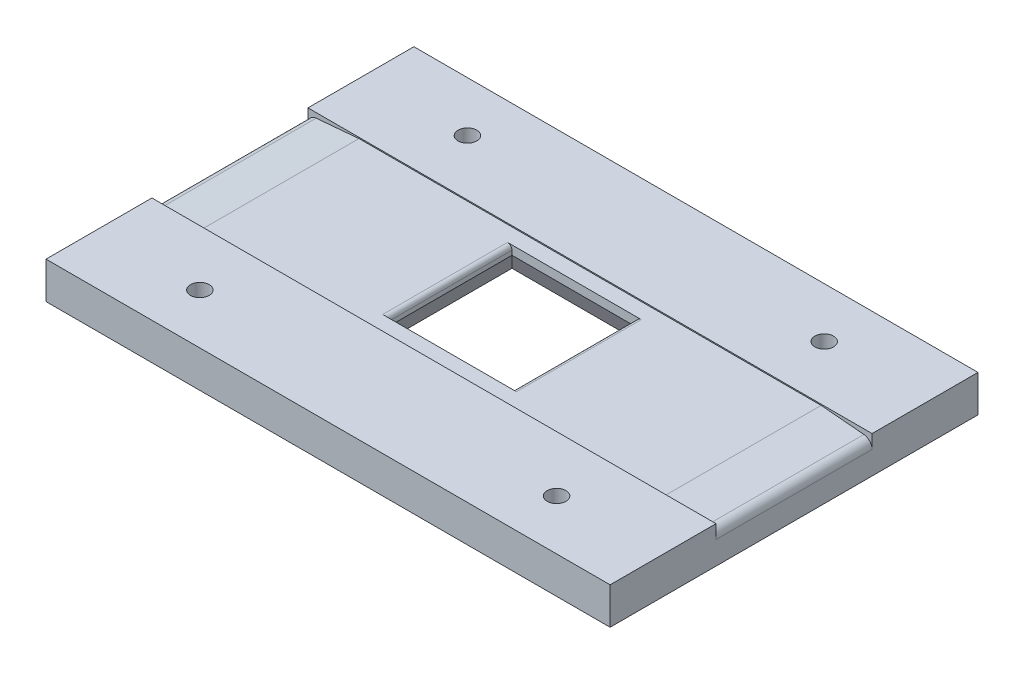
ISO-10303-21;
HEADER;
FILE_DESCRIPTION(('STEP AP214'),'2;1');
FILE_NAME('part.step','',(''),(''),'','','');
FILE_SCHEMA(('AUTOMOTIVE_DESIGN { 1 0 10303 214 1 1 1 1 }'));
ENDSEC;
DATA;
#1=APPLICATION_CONTEXT('core data for automotive mechanical design processes');
#2=APPLICATION_PROTOCOL_DEFINITION('international standard','automotive_design',2000,#1);
#3=PRODUCT_CONTEXT('',#1,'mechanical');
#4=PRODUCT('Part','Part','',(#3));
#5=PRODUCT_RELATED_PRODUCT_CATEGORY('part','',(#4));
#6=PRODUCT_DEFINITION_FORMATION('','',#4);
#7=PRODUCT_DEFINITION_CONTEXT('part definition',#1,'design');
#8=PRODUCT_DEFINITION('design','',#6,#7);
#9=PRODUCT_DEFINITION_SHAPE('','',#8);
#10=(LENGTH_UNIT() NAMED_UNIT(*) SI_UNIT(.MILLI.,.METRE.));
#11=(NAMED_UNIT(*) PLANE_ANGLE_UNIT() SI_UNIT($,.RADIAN.));
#12=(NAMED_UNIT(*) SI_UNIT($,.STERADIAN.) SOLID_ANGLE_UNIT());
#13=UNCERTAINTY_MEASURE_WITH_UNIT(LENGTH_MEASURE(1.E-05),#10,'distance_accuracy_value','');
#14=(GEOMETRIC_REPRESENTATION_CONTEXT(3) GLOBAL_UNCERTAINTY_ASSIGNED_CONTEXT((#13)) GLOBAL_UNIT_ASSIGNED_CONTEXT((#10,
#11,#12)) REPRESENTATION_CONTEXT('',''));
#15=CARTESIAN_POINT('',(0.,0.,0.));
#16=DIRECTION('',(0.,0.,1.));
#17=DIRECTION('',(1.,0.,0.));
#18=AXIS2_PLACEMENT_3D('',#15,#16,#17);
#19=CARTESIAN_POINT('',(0.,8.,0.));
#20=DIRECTION('',(0.,1.,0.));
#21=DIRECTION('',(0.,0.,1.));
#22=AXIS2_PLACEMENT_3D('',#19,#20,#21);
#23=PLANE('',#22);
#24=DIRECTION('',(-1.,0.,0.));
#25=VECTOR('',#24,1.);
#26=CARTESIAN_POINT('',(14.,8.,-14.));
#27=LINE('',#26,#25);
#28=CARTESIAN_POINT('',(15.,8.,-14.));
#29=VERTEX_POINT('',#28);
#30=CARTESIAN_POINT('',(-15.,8.,-14.));
#31=VERTEX_POINT('',#30);
#32=EDGE_CURVE('E232',#29,#31,#27,.T.);
#33=ORIENTED_EDGE('',*,*,#32,.F.);
#34=DIRECTION('',(0.,0.,-1.));
#35=VECTOR('',#34,1.);
#36=CARTESIAN_POINT('',(15.,8.,0.));
#37=LINE('',#36,#35);
#38=CARTESIAN_POINT('',(15.,8.,14.));
#39=VERTEX_POINT('',#38);
#40=EDGE_CURVE('E300',#29,#39,#37,.F.);
#41=ORIENTED_EDGE('',*,*,#40,.T.);
#42=DIRECTION('',(1.,0.,0.));
#43=VECTOR('',#42,1.);
#44=CARTESIAN_POINT('',(-14.,8.,14.));
#45=LINE('',#44,#43);
#46=CARTESIAN_POINT('',(-15.,8.,14.));
#47=VERTEX_POINT('',#46);
#48=EDGE_CURVE('E230',#47,#39,#45,.T.);
#49=ORIENTED_EDGE('',*,*,#48,.F.);
#50=DIRECTION('',(0.,0.,1.));
#51=VECTOR('',#50,1.);
#52=CARTESIAN_POINT('',(-15.,8.,0.));
#53=LINE('',#52,#51);
#54=EDGE_CURVE('E297',#47,#31,#53,.F.);
#55=ORIENTED_EDGE('',*,*,#54,.T.);
#56=EDGE_LOOP('',(#33,#41,#49,#55));
#57=FACE_BOUND('',#56,.T.);
#58=DIRECTION('',(-1.,0.,0.));
#59=VECTOR('',#58,1.);
#60=CARTESIAN_POINT('',(-63.25,8.,17.5));
#61=LINE('',#60,#59);
#62=CARTESIAN_POINT('',(51.8199476972382,8.,17.5));
#63=VERTEX_POINT('',#62);
#64=CARTESIAN_POINT('',(-51.8199476972382,8.,17.5));
#65=VERTEX_POINT('',#64);
#66=EDGE_CURVE('E198',#63,#65,#61,.T.);
#67=ORIENTED_EDGE('',*,*,#66,.F.);
#68=DIRECTION('',(0.,0.,-1.));
#69=VECTOR('',#68,1.);
#70=CARTESIAN_POINT('',(51.8199476972382,8.,-17.5));
#71=LINE('',#70,#69);
#72=CARTESIAN_POINT('',(51.8199476972382,8.,-17.5));
#73=VERTEX_POINT('',#72);
#74=EDGE_CURVE('E262',#63,#73,#71,.T.);
#75=ORIENTED_EDGE('',*,*,#74,.T.);
#76=DIRECTION('',(1.,0.,0.));
#77=VECTOR('',#76,1.);
#78=CARTESIAN_POINT('',(-63.25,8.,-17.5));
#79=LINE('',#78,#77);
#80=CARTESIAN_POINT('',(-51.8199476972382,8.,-17.5));
#81=VERTEX_POINT('',#80);
#82=EDGE_CURVE('E212',#81,#73,#79,.T.);
#83=ORIENTED_EDGE('',*,*,#82,.F.);
#84=DIRECTION('',(0.,0.,1.));
#85=VECTOR('',#84,1.);
#86=CARTESIAN_POINT('',(-51.8199476972382,8.,17.5));
#87=LINE('',#86,#85);
#88=EDGE_CURVE('E259',#81,#65,#87,.T.);
#89=ORIENTED_EDGE('',*,*,#88,.T.);
#90=EDGE_LOOP('',(#67,#75,#83,#89));
#91=FACE_BOUND('',#90,.T.);
#92=ADVANCED_FACE('F35',(#57,#91),#23,.T.);
#93=CARTESIAN_POINT('',(0.,0.,0.));
#94=DIRECTION('',(0.,1.,0.));
#95=DIRECTION('',(0.,0.,1.));
#96=AXIS2_PLACEMENT_3D('',#93,#94,#95);
#97=PLANE('',#96);
#98=CARTESIAN_POINT('',(40.,0.,-30.));
#99=DIRECTION('',(0.,1.,0.));
#100=DIRECTION('',(0.,0.,1.));
#101=AXIS2_PLACEMENT_3D('',#98,#99,#100);
#102=CIRCLE('',#101,2.1);
#103=CARTESIAN_POINT('',(40.,0.,-27.9));
#104=VERTEX_POINT('',#103);
#105=EDGE_CURVE('E644',#104,#104,#102,.T.);
#106=ORIENTED_EDGE('',*,*,#105,.T.);
#107=EDGE_LOOP('',(#106));
#108=FACE_BOUND('',#107,.T.);
#109=CARTESIAN_POINT('',(-40.,0.,30.));
#110=DIRECTION('',(0.,1.,0.));
#111=DIRECTION('',(0.,0.,1.));
#112=AXIS2_PLACEMENT_3D('',#109,#110,#111);
#113=CIRCLE('',#112,2.1);
#114=CARTESIAN_POINT('',(-40.,0.,32.1));
#115=VERTEX_POINT('',#114);
#116=EDGE_CURVE('E648',#115,#115,#113,.T.);
#117=ORIENTED_EDGE('',*,*,#116,.T.);
#118=EDGE_LOOP('',(#117));
#119=FACE_BOUND('',#118,.T.);
#120=CARTESIAN_POINT('',(40.,0.,30.));
#121=DIRECTION('',(0.,1.,0.));
#122=DIRECTION('',(0.,0.,1.));
#123=AXIS2_PLACEMENT_3D('',#120,#121,#122);
#124=CIRCLE('',#123,2.1);
#125=CARTESIAN_POINT('',(40.,0.,32.1));
#126=VERTEX_POINT('',#125);
#127=EDGE_CURVE('E656',#126,#126,#124,.T.);
#128=ORIENTED_EDGE('',*,*,#127,.T.);
#129=EDGE_LOOP('',(#128));
#130=FACE_BOUND('',#129,.T.);
#131=CARTESIAN_POINT('',(-40.,0.,-30.));
#132=DIRECTION('',(0.,1.,0.));
#133=DIRECTION('',(0.,0.,1.));
#134=AXIS2_PLACEMENT_3D('',#131,#132,#133);
#135=CIRCLE('',#134,2.1);
#136=CARTESIAN_POINT('',(-40.,0.,-27.9));
#137=VERTEX_POINT('',#136);
#138=EDGE_CURVE('E201',#137,#137,#135,.T.);
#139=ORIENTED_EDGE('',*,*,#138,.T.);
#140=EDGE_LOOP('',(#139));
#141=FACE_BOUND('',#140,.T.);
#142=DIRECTION('',(0.,0.,-1.));
#143=VECTOR('',#142,1.);
#144=CARTESIAN_POINT('',(63.25,0.,-41.25));
#145=LINE('',#144,#143);
#146=CARTESIAN_POINT('',(63.25,0.,41.25));
#147=VERTEX_POINT('',#146);
#148=CARTESIAN_POINT('',(63.25,0.,-41.25));
#149=VERTEX_POINT('',#148);
#150=EDGE_CURVE('E246',#147,#149,#145,.T.);
#151=ORIENTED_EDGE('',*,*,#150,.F.);
#152=DIRECTION('',(1.,0.,0.));
#153=VECTOR('',#152,1.);
#154=CARTESIAN_POINT('',(-63.25,0.,41.25));
#155=LINE('',#154,#153);
#156=CARTESIAN_POINT('',(-63.25,0.,41.25));
#157=VERTEX_POINT('',#156);
#158=EDGE_CURVE('E252',#157,#147,#155,.T.);
#159=ORIENTED_EDGE('',*,*,#158,.F.);
#160=DIRECTION('',(0.,0.,1.));
#161=VECTOR('',#160,1.);
#162=CARTESIAN_POINT('',(-63.25,0.,41.25));
#163=LINE('',#162,#161);
#164=CARTESIAN_POINT('',(-63.25,0.,-41.25));
#165=VERTEX_POINT('',#164);
#166=EDGE_CURVE('E180',#165,#157,#163,.T.);
#167=ORIENTED_EDGE('',*,*,#166,.F.);
#168=DIRECTION('',(-1.,0.,0.));
#169=VECTOR('',#168,1.);
#170=CARTESIAN_POINT('',(-63.25,0.,-41.25));
#171=LINE('',#170,#169);
#172=EDGE_CURVE('E249',#149,#165,#171,.T.);
#173=ORIENTED_EDGE('',*,*,#172,.F.);
#174=EDGE_LOOP('',(#151,#159,#167,#173));
#175=FACE_BOUND('',#174,.T.);
#176=DIRECTION('',(1.,0.,0.));
#177=VECTOR('',#176,1.);
#178=CARTESIAN_POINT('',(17.4641016151378,0.,17.4641016151378));
#179=LINE('',#178,#177);
#180=CARTESIAN_POINT('',(-17.4641016151377,0.,17.4641016151378));
#181=VERTEX_POINT('',#180);
#182=CARTESIAN_POINT('',(17.4641016151378,0.,17.4641016151378));
#183=VERTEX_POINT('',#182);
#184=EDGE_CURVE('E326',#181,#183,#179,.T.);
#185=ORIENTED_EDGE('',*,*,#184,.T.);
#186=DIRECTION('',(0.,0.,-1.));
#187=VECTOR('',#186,1.);
#188=CARTESIAN_POINT('',(17.4641016151378,0.,-14.));
#189=LINE('',#188,#187);
#190=CARTESIAN_POINT('',(17.4641016151378,0.,-17.4641016151378));
#191=VERTEX_POINT('',#190);
#192=EDGE_CURVE('E49',#183,#191,#189,.T.);
#193=ORIENTED_EDGE('',*,*,#192,.T.);
#194=DIRECTION('',(-1.,0.,0.));
#195=VECTOR('',#194,1.);
#196=CARTESIAN_POINT('',(-17.4641016151377,0.,-17.4641016151378));
#197=LINE('',#196,#195);
#198=CARTESIAN_POINT('',(-17.4641016151378,0.,-17.4641016151378));
#199=VERTEX_POINT('',#198);
#200=EDGE_CURVE('E324',#191,#199,#197,.T.);
#201=ORIENTED_EDGE('',*,*,#200,.T.);
#202=DIRECTION('',(0.,0.,1.));
#203=VECTOR('',#202,1.);
#204=CARTESIAN_POINT('',(-17.4641016151377,0.,14.));
#205=LINE('',#204,#203);
#206=EDGE_CURVE('E57',#199,#181,#205,.T.);
#207=ORIENTED_EDGE('',*,*,#206,.T.);
#208=EDGE_LOOP('',(#185,#193,#201,#207));
#209=FACE_BOUND('',#208,.T.);
#210=ADVANCED_FACE('F366',(#108,#119,#130,#141,#175,#209),#97,.F.);
#211=CARTESIAN_POINT('',(63.25,8.,-41.25));
#212=DIRECTION('',(-1.,0.,0.));
#213=DIRECTION('',(0.,0.,1.));
#214=AXIS2_PLACEMENT_3D('',#211,#212,#213);
#215=PLANE('',#214);
#216=DIRECTION('',(0.,0.,1.));
#217=VECTOR('',#216,1.);
#218=CARTESIAN_POINT('',(63.25,5.16733765196515,17.5));
#219=LINE('',#218,#217);
#220=CARTESIAN_POINT('',(63.25,5.16733765196515,-17.5));
#221=VERTEX_POINT('',#220);
#222=CARTESIAN_POINT('',(63.25,5.16733765196515,17.5));
#223=VERTEX_POINT('',#222);
#224=EDGE_CURVE('E275',#221,#223,#219,.T.);
#225=ORIENTED_EDGE('',*,*,#224,.T.);
#226=DIRECTION('',(0.,-1.,0.));
#227=VECTOR('',#226,1.);
#228=CARTESIAN_POINT('',(63.25,8.25,17.5));
#229=LINE('',#228,#227);
#230=CARTESIAN_POINT('',(63.25,8.25,17.5));
#231=VERTEX_POINT('',#230);
#232=EDGE_CURVE('E210',#231,#223,#229,.T.);
#233=ORIENTED_EDGE('',*,*,#232,.F.);
#234=DIRECTION('',(0.,0.,-1.));
#235=VECTOR('',#234,1.);
#236=CARTESIAN_POINT('',(63.25,8.25,41.25));
#237=LINE('',#236,#235);
#238=CARTESIAN_POINT('',(63.25,8.25,41.25));
#239=VERTEX_POINT('',#238);
#240=EDGE_CURVE('E192',#239,#231,#237,.T.);
#241=ORIENTED_EDGE('',*,*,#240,.F.);
#242=DIRECTION('',(0.,-1.,0.));
#243=VECTOR('',#242,1.);
#244=CARTESIAN_POINT('',(63.25,8.,41.25));
#245=LINE('',#244,#243);
#246=EDGE_CURVE('E184',#239,#147,#245,.T.);
#247=ORIENTED_EDGE('',*,*,#246,.T.);
#248=ORIENTED_EDGE('',*,*,#150,.T.);
#249=DIRECTION('',(0.,-1.,0.));
#250=VECTOR('',#249,1.);
#251=CARTESIAN_POINT('',(63.25,8.,-41.25));
#252=LINE('',#251,#250);
#253=CARTESIAN_POINT('',(63.25,8.25,-41.25));
#254=VERTEX_POINT('',#253);
#255=EDGE_CURVE('E256',#254,#149,#252,.T.);
#256=ORIENTED_EDGE('',*,*,#255,.F.);
#257=DIRECTION('',(0.,0.,-1.));
#258=VECTOR('',#257,1.);
#259=CARTESIAN_POINT('',(63.25,8.25,-41.25));
#260=LINE('',#259,#258);
#261=CARTESIAN_POINT('',(63.25,8.25,-17.5));
#262=VERTEX_POINT('',#261);
#263=EDGE_CURVE('E218',#262,#254,#260,.T.);
#264=ORIENTED_EDGE('',*,*,#263,.F.);
#265=DIRECTION('',(0.,-1.,0.));
#266=VECTOR('',#265,1.);
#267=CARTESIAN_POINT('',(63.25,8.25,-17.5));
#268=LINE('',#267,#266);
#269=EDGE_CURVE('E224',#262,#221,#268,.T.);
#270=ORIENTED_EDGE('',*,*,#269,.T.);
#271=EDGE_LOOP('',(#225,#233,#241,#247,#248,#256,#264,#270));
#272=FACE_BOUND('',#271,.T.);
#273=ADVANCED_FACE('F368',(#272),#215,.F.);
#274=CARTESIAN_POINT('',(-63.25,8.,-41.25));
#275=DIRECTION('',(0.,0.,1.));
#276=DIRECTION('',(1.,0.,0.));
#277=AXIS2_PLACEMENT_3D('',#274,#275,#276);
#278=PLANE('',#277);
#279=ORIENTED_EDGE('',*,*,#172,.T.);
#280=DIRECTION('',(0.,-1.,0.));
#281=VECTOR('',#280,1.);
#282=CARTESIAN_POINT('',(-63.25,8.,-41.25));
#283=LINE('',#282,#281);
#284=CARTESIAN_POINT('',(-63.25,8.25,-41.25));
#285=VERTEX_POINT('',#284);
#286=EDGE_CURVE('E183',#285,#165,#283,.T.);
#287=ORIENTED_EDGE('',*,*,#286,.F.);
#288=DIRECTION('',(-1.,0.,0.));
#289=VECTOR('',#288,1.);
#290=CARTESIAN_POINT('',(-63.25,8.25,-41.25));
#291=LINE('',#290,#289);
#292=EDGE_CURVE('E221',#254,#285,#291,.T.);
#293=ORIENTED_EDGE('',*,*,#292,.F.);
#294=ORIENTED_EDGE('',*,*,#255,.T.);
#295=EDGE_LOOP('',(#279,#287,#293,#294));
#296=FACE_BOUND('',#295,.T.);
#297=ADVANCED_FACE('F376',(#296),#278,.F.);
#298=CARTESIAN_POINT('',(-63.25,8.,41.25));
#299=DIRECTION('',(1.,0.,0.));
#300=DIRECTION('',(0.,0.,-1.));
#301=AXIS2_PLACEMENT_3D('',#298,#299,#300);
#302=PLANE('',#301);
#303=DIRECTION('',(0.,0.,-1.));
#304=VECTOR('',#303,1.);
#305=CARTESIAN_POINT('',(-63.25,5.16733765196515,-17.5));
#306=LINE('',#305,#304);
#307=CARTESIAN_POINT('',(-63.25,5.16733765196515,17.5));
#308=VERTEX_POINT('',#307);
#309=CARTESIAN_POINT('',(-63.25,5.16733765196515,-17.5));
#310=VERTEX_POINT('',#309);
#311=EDGE_CURVE('E280',#308,#310,#306,.T.);
#312=ORIENTED_EDGE('',*,*,#311,.T.);
#313=DIRECTION('',(0.,-1.,0.));
#314=VECTOR('',#313,1.);
#315=CARTESIAN_POINT('',(-63.25,8.25,-17.5));
#316=LINE('',#315,#314);
#317=CARTESIAN_POINT('',(-63.25,8.25,-17.5));
#318=VERTEX_POINT('',#317);
#319=EDGE_CURVE('E228',#318,#310,#316,.T.);
#320=ORIENTED_EDGE('',*,*,#319,.F.);
#321=DIRECTION('',(0.,0.,1.));
#322=VECTOR('',#321,1.);
#323=CARTESIAN_POINT('',(-63.25,8.25,-17.5));
#324=LINE('',#323,#322);
#325=EDGE_CURVE('E213',#285,#318,#324,.T.);
#326=ORIENTED_EDGE('',*,*,#325,.F.);
#327=ORIENTED_EDGE('',*,*,#286,.T.);
#328=ORIENTED_EDGE('',*,*,#166,.T.);
#329=DIRECTION('',(0.,-1.,0.));
#330=VECTOR('',#329,1.);
#331=CARTESIAN_POINT('',(-63.25,8.,41.25));
#332=LINE('',#331,#330);
#333=CARTESIAN_POINT('',(-63.25,8.25,41.25));
#334=VERTEX_POINT('',#333);
#335=EDGE_CURVE('E172',#334,#157,#332,.T.);
#336=ORIENTED_EDGE('',*,*,#335,.F.);
#337=DIRECTION('',(0.,0.,1.));
#338=VECTOR('',#337,1.);
#339=CARTESIAN_POINT('',(-63.25,8.25,17.5));
#340=LINE('',#339,#338);
#341=CARTESIAN_POINT('',(-63.25,8.25,17.5));
#342=VERTEX_POINT('',#341);
#343=EDGE_CURVE('E177',#342,#334,#340,.T.);
#344=ORIENTED_EDGE('',*,*,#343,.F.);
#345=DIRECTION('',(0.,-1.,0.));
#346=VECTOR('',#345,1.);
#347=CARTESIAN_POINT('',(-63.25,8.25,17.5));
#348=LINE('',#347,#346);
#349=EDGE_CURVE('E207',#342,#308,#348,.T.);
#350=ORIENTED_EDGE('',*,*,#349,.T.);
#351=EDGE_LOOP('',(#312,#320,#326,#327,#328,#336,#344,#350));
#352=FACE_BOUND('',#351,.T.);
#353=ADVANCED_FACE('F175',(#352),#302,.F.);
#354=CARTESIAN_POINT('',(-63.25,8.,41.25));
#355=DIRECTION('',(0.,0.,-1.));
#356=DIRECTION('',(-1.,0.,0.));
#357=AXIS2_PLACEMENT_3D('',#354,#355,#356);
#358=PLANE('',#357);
#359=ORIENTED_EDGE('',*,*,#158,.T.);
#360=ORIENTED_EDGE('',*,*,#246,.F.);
#361=DIRECTION('',(1.,0.,0.));
#362=VECTOR('',#361,1.);
#363=CARTESIAN_POINT('',(-63.25,8.25,41.25));
#364=LINE('',#363,#362);
#365=EDGE_CURVE('E187',#334,#239,#364,.T.);
#366=ORIENTED_EDGE('',*,*,#365,.F.);
#367=ORIENTED_EDGE('',*,*,#335,.T.);
#368=EDGE_LOOP('',(#359,#360,#366,#367));
#369=FACE_BOUND('',#368,.T.);
#370=ADVANCED_FACE('F188',(#369),#358,.F.);
#371=CARTESIAN_POINT('',(-14.,8.,-14.));
#372=DIRECTION('',(1.,0.,0.));
#373=DIRECTION('',(0.,0.,-1.));
#374=AXIS2_PLACEMENT_3D('',#371,#372,#373);
#375=PLANE('',#374);
#376=DIRECTION('',(0.,-1.,0.));
#377=VECTOR('',#376,1.);
#378=CARTESIAN_POINT('',(-14.,8.,14.));
#379=LINE('',#378,#377);
#380=CARTESIAN_POINT('',(-14.,7.,14.));
#381=VERTEX_POINT('',#380);
#382=CARTESIAN_POINT('',(-14.,6.00000000000003,14.));
#383=VERTEX_POINT('',#382);
#384=EDGE_CURVE('E243',#381,#383,#379,.T.);
#385=ORIENTED_EDGE('',*,*,#384,.T.);
#386=DIRECTION('',(0.,0.,-1.));
#387=VECTOR('',#386,1.);
#388=CARTESIAN_POINT('',(-14.,6.00000000000003,-14.));
#389=LINE('',#388,#387);
#390=CARTESIAN_POINT('',(-14.,6.00000000000003,-14.));
#391=VERTEX_POINT('',#390);
#392=EDGE_CURVE('E321',#383,#391,#389,.T.);
#393=ORIENTED_EDGE('',*,*,#392,.T.);
#394=DIRECTION('',(0.,-1.,0.));
#395=VECTOR('',#394,1.);
#396=CARTESIAN_POINT('',(-14.,8.,-14.));
#397=LINE('',#396,#395);
#398=CARTESIAN_POINT('',(-14.,7.,-14.));
#399=VERTEX_POINT('',#398);
#400=EDGE_CURVE('E234',#399,#391,#397,.T.);
#401=ORIENTED_EDGE('',*,*,#400,.F.);
#402=DIRECTION('',(0.,0.,1.));
#403=VECTOR('',#402,1.);
#404=CARTESIAN_POINT('',(-14.,7.,-14.));
#405=LINE('',#404,#403);
#406=EDGE_CURVE('E303',#399,#381,#405,.T.);
#407=ORIENTED_EDGE('',*,*,#406,.T.);
#408=EDGE_LOOP('',(#385,#393,#401,#407));
#409=FACE_BOUND('',#408,.T.);
#410=ADVANCED_FACE('F345',(#409),#375,.T.);
#411=CARTESIAN_POINT('',(-14.,8.,14.));
#412=DIRECTION('',(0.,0.,-1.));
#413=DIRECTION('',(-1.,0.,0.));
#414=AXIS2_PLACEMENT_3D('',#411,#412,#413);
#415=PLANE('',#414);
#416=DIRECTION('',(0.,-1.,0.));
#417=VECTOR('',#416,1.);
#418=CARTESIAN_POINT('',(14.,8.,14.));
#419=LINE('',#418,#417);
#420=CARTESIAN_POINT('',(14.,7.,14.));
#421=VERTEX_POINT('',#420);
#422=CARTESIAN_POINT('',(14.,6.00000000000006,14.));
#423=VERTEX_POINT('',#422);
#424=EDGE_CURVE('E240',#421,#423,#419,.T.);
#425=ORIENTED_EDGE('',*,*,#424,.T.);
#426=DIRECTION('',(-1.,0.,0.));
#427=VECTOR('',#426,1.);
#428=CARTESIAN_POINT('',(-17.4641016151377,6.00000000000006,14.));
#429=LINE('',#428,#427);
#430=EDGE_CURVE('E328',#423,#383,#429,.T.);
#431=ORIENTED_EDGE('',*,*,#430,.T.);
#432=ORIENTED_EDGE('',*,*,#384,.F.);
#433=CARTESIAN_POINT('',(-15.,7.,14.));
#434=DIRECTION('',(0.,0.,-1.));
#435=DIRECTION('',(-1.,0.,0.));
#436=AXIS2_PLACEMENT_3D('',#433,#434,#435);
#437=CIRCLE('',#436,1.);
#438=EDGE_CURVE('E311',#381,#47,#437,.F.);
#439=ORIENTED_EDGE('',*,*,#438,.T.);
#440=ORIENTED_EDGE('',*,*,#48,.T.);
#441=CARTESIAN_POINT('',(15.,7.,14.));
#442=DIRECTION('',(0.,0.,-1.));
#443=DIRECTION('',(-1.,0.,0.));
#444=AXIS2_PLACEMENT_3D('',#441,#442,#443);
#445=CIRCLE('',#444,1.);
#446=EDGE_CURVE('E309',#39,#421,#445,.F.);
#447=ORIENTED_EDGE('',*,*,#446,.T.);
#448=EDGE_LOOP('',(#425,#431,#432,#439,#440,#447));
#449=FACE_BOUND('',#448,.T.);
#450=ADVANCED_FACE('F361',(#449),#415,.T.);
#451=CARTESIAN_POINT('',(14.,8.,14.));
#452=DIRECTION('',(-1.,0.,0.));
#453=DIRECTION('',(0.,0.,1.));
#454=AXIS2_PLACEMENT_3D('',#451,#452,#453);
#455=PLANE('',#454);
#456=DIRECTION('',(0.,-1.,0.));
#457=VECTOR('',#456,1.);
#458=CARTESIAN_POINT('',(14.,8.,-14.));
#459=LINE('',#458,#457);
#460=CARTESIAN_POINT('',(14.,7.,-14.));
#461=VERTEX_POINT('',#460);
#462=CARTESIAN_POINT('',(14.,6.00000000000006,-14.));
#463=VERTEX_POINT('',#462);
#464=EDGE_CURVE('E237',#461,#463,#459,.T.);
#465=ORIENTED_EDGE('',*,*,#464,.T.);
#466=DIRECTION('',(0.,0.,1.));
#467=VECTOR('',#466,1.);
#468=CARTESIAN_POINT('',(14.,6.00000000000006,14.));
#469=LINE('',#468,#467);
#470=EDGE_CURVE('E318',#463,#423,#469,.T.);
#471=ORIENTED_EDGE('',*,*,#470,.T.);
#472=ORIENTED_EDGE('',*,*,#424,.F.);
#473=DIRECTION('',(0.,0.,-1.));
#474=VECTOR('',#473,1.);
#475=CARTESIAN_POINT('',(14.,7.,14.));
#476=LINE('',#475,#474);
#477=EDGE_CURVE('E294',#421,#461,#476,.T.);
#478=ORIENTED_EDGE('',*,*,#477,.T.);
#479=EDGE_LOOP('',(#465,#471,#472,#478));
#480=FACE_BOUND('',#479,.T.);
#481=ADVANCED_FACE('F357',(#480),#455,.T.);
#482=CARTESIAN_POINT('',(14.,8.,-14.));
#483=DIRECTION('',(0.,0.,1.));
#484=DIRECTION('',(1.,0.,0.));
#485=AXIS2_PLACEMENT_3D('',#482,#483,#484);
#486=PLANE('',#485);
#487=ORIENTED_EDGE('',*,*,#400,.T.);
#488=DIRECTION('',(1.,0.,0.));
#489=VECTOR('',#488,1.);
#490=CARTESIAN_POINT('',(17.4641016151378,6.00000000000003,-14.));
#491=LINE('',#490,#489);
#492=EDGE_CURVE('E330',#391,#463,#491,.T.);
#493=ORIENTED_EDGE('',*,*,#492,.T.);
#494=ORIENTED_EDGE('',*,*,#464,.F.);
#495=CARTESIAN_POINT('',(15.,7.,-14.));
#496=DIRECTION('',(0.,0.,1.));
#497=DIRECTION('',(1.,0.,0.));
#498=AXIS2_PLACEMENT_3D('',#495,#496,#497);
#499=CIRCLE('',#498,1.);
#500=EDGE_CURVE('E306',#461,#29,#499,.F.);
#501=ORIENTED_EDGE('',*,*,#500,.T.);
#502=ORIENTED_EDGE('',*,*,#32,.T.);
#503=CARTESIAN_POINT('',(-15.,7.,-14.));
#504=DIRECTION('',(0.,0.,1.));
#505=DIRECTION('',(1.,0.,0.));
#506=AXIS2_PLACEMENT_3D('',#503,#504,#505);
#507=CIRCLE('',#506,1.);
#508=EDGE_CURVE('E314',#31,#399,#507,.F.);
#509=ORIENTED_EDGE('',*,*,#508,.T.);
#510=EDGE_LOOP('',(#487,#493,#494,#501,#502,#509));
#511=FACE_BOUND('',#510,.T.);
#512=ADVANCED_FACE('F349',(#511),#486,.T.);
#513=CARTESIAN_POINT('',(-63.25,8.25,-17.5));
#514=DIRECTION('',(0.,0.,-1.));
#515=DIRECTION('',(-1.,0.,0.));
#516=AXIS2_PLACEMENT_3D('',#513,#514,#515);
#517=PLANE('',#516);
#518=ORIENTED_EDGE('',*,*,#319,.T.);
#519=CARTESIAN_POINT('',(-61.25,5.16733765196515,-17.5));
#520=DIRECTION('',(0.,0.,-1.));
#521=DIRECTION('',(-1.,0.,0.));
#522=AXIS2_PLACEMENT_3D('',#519,#520,#521);
#523=CIRCLE('',#522,2.);
#524=CARTESIAN_POINT('',(-61.4243114854953,7.15972704814864,-17.5));
#525=VERTEX_POINT('',#524);
#526=EDGE_CURVE('E289',#310,#525,#523,.T.);
#527=ORIENTED_EDGE('',*,*,#526,.T.);
#528=DIRECTION('',(0.996194698091746,0.0871557427476551,0.));
#529=VECTOR('',#528,1.);
#530=CARTESIAN_POINT('',(-63.1414698889582,7.00949515436737,-17.5));
#531=LINE('',#530,#529);
#532=EDGE_CURVE('E273',#525,#81,#531,.T.);
#533=ORIENTED_EDGE('',*,*,#532,.T.);
#534=ORIENTED_EDGE('',*,*,#82,.T.);
#535=DIRECTION('',(0.996194698091746,-0.0871557427476551,0.));
#536=VECTOR('',#535,1.);
#537=CARTESIAN_POINT('',(-62.3976204890641,17.9927423918003,-17.5));
#538=LINE('',#537,#536);
#539=CARTESIAN_POINT('',(61.4243114854953,7.15972704814863,-17.5));
#540=VERTEX_POINT('',#539);
#541=EDGE_CURVE('E265',#73,#540,#538,.T.);
#542=ORIENTED_EDGE('',*,*,#541,.T.);
#543=CARTESIAN_POINT('',(61.25,5.16733765196515,-17.5));
#544=DIRECTION('',(0.,0.,-1.));
#545=DIRECTION('',(-1.,0.,0.));
#546=AXIS2_PLACEMENT_3D('',#543,#544,#545);
#547=CIRCLE('',#546,2.);
#548=EDGE_CURVE('E286',#540,#221,#547,.T.);
#549=ORIENTED_EDGE('',*,*,#548,.T.);
#550=ORIENTED_EDGE('',*,*,#269,.F.);
#551=DIRECTION('',(1.,0.,0.));
#552=VECTOR('',#551,1.);
#553=CARTESIAN_POINT('',(-63.25,8.25,-17.5));
#554=LINE('',#553,#552);
#555=EDGE_CURVE('E216',#318,#262,#554,.T.);
#556=ORIENTED_EDGE('',*,*,#555,.F.);
#557=EDGE_LOOP('',(#518,#527,#533,#534,#542,#549,#550,#556));
#558=FACE_BOUND('',#557,.T.);
#559=ADVANCED_FACE('F454',(#558),#517,.F.);
#560=CARTESIAN_POINT('',(0.,8.25,0.));
#561=DIRECTION('',(0.,-1.,0.));
#562=DIRECTION('',(0.,0.,-1.));
#563=AXIS2_PLACEMENT_3D('',#560,#561,#562);
#564=PLANE('',#563);
#565=CARTESIAN_POINT('',(40.,8.25,-30.));
#566=DIRECTION('',(0.,1.,0.));
#567=DIRECTION('',(0.,0.,1.));
#568=AXIS2_PLACEMENT_3D('',#565,#566,#567);
#569=CIRCLE('',#568,2.1);
#570=CARTESIAN_POINT('',(40.,8.25,-27.9));
#571=VERTEX_POINT('',#570);
#572=EDGE_CURVE('E647',#571,#571,#569,.T.);
#573=ORIENTED_EDGE('',*,*,#572,.F.);
#574=EDGE_LOOP('',(#573));
#575=FACE_BOUND('',#574,.T.);
#576=CARTESIAN_POINT('',(-40.,8.25,-30.));
#577=DIRECTION('',(0.,1.,0.));
#578=DIRECTION('',(0.,0.,1.));
#579=AXIS2_PLACEMENT_3D('',#576,#577,#578);
#580=CIRCLE('',#579,2.1);
#581=CARTESIAN_POINT('',(-40.,8.25,-27.9));
#582=VERTEX_POINT('',#581);
#583=EDGE_CURVE('E650',#582,#582,#580,.T.);
#584=ORIENTED_EDGE('',*,*,#583,.F.);
#585=EDGE_LOOP('',(#584));
#586=FACE_BOUND('',#585,.T.);
#587=ORIENTED_EDGE('',*,*,#325,.T.);
#588=ORIENTED_EDGE('',*,*,#555,.T.);
#589=ORIENTED_EDGE('',*,*,#263,.T.);
#590=ORIENTED_EDGE('',*,*,#292,.T.);
#591=EDGE_LOOP('',(#587,#588,#589,#590));
#592=FACE_BOUND('',#591,.T.);
#593=ADVANCED_FACE('F520',(#575,#586,#592),#564,.F.);
#594=CARTESIAN_POINT('',(-63.25,8.25,17.5));
#595=DIRECTION('',(0.,0.,1.));
#596=DIRECTION('',(1.,0.,0.));
#597=AXIS2_PLACEMENT_3D('',#594,#595,#596);
#598=PLANE('',#597);
#599=ORIENTED_EDGE('',*,*,#232,.T.);
#600=CARTESIAN_POINT('',(61.25,5.16733765196515,17.5));
#601=DIRECTION('',(0.,0.,1.));
#602=DIRECTION('',(1.,0.,0.));
#603=AXIS2_PLACEMENT_3D('',#600,#601,#602);
#604=CIRCLE('',#603,2.);
#605=CARTESIAN_POINT('',(61.4243114854953,7.15972704814863,17.5));
#606=VERTEX_POINT('',#605);
#607=EDGE_CURVE('E284',#223,#606,#604,.T.);
#608=ORIENTED_EDGE('',*,*,#607,.T.);
#609=DIRECTION('',(-0.996194698091746,0.0871557427476551,0.));
#610=VECTOR('',#609,1.);
#611=CARTESIAN_POINT('',(-62.3976204890641,17.9927423918003,17.5));
#612=LINE('',#611,#610);
#613=EDGE_CURVE('E268',#606,#63,#612,.T.);
#614=ORIENTED_EDGE('',*,*,#613,.T.);
#615=ORIENTED_EDGE('',*,*,#66,.T.);
#616=DIRECTION('',(-0.996194698091746,-0.0871557427476551,0.));
#617=VECTOR('',#616,1.);
#618=CARTESIAN_POINT('',(-63.1414698889582,7.00949515436737,17.5));
#619=LINE('',#618,#617);
#620=CARTESIAN_POINT('',(-61.4243114854953,7.15972704814864,17.5));
#621=VERTEX_POINT('',#620);
#622=EDGE_CURVE('E270',#65,#621,#619,.T.);
#623=ORIENTED_EDGE('',*,*,#622,.T.);
#624=CARTESIAN_POINT('',(-61.25,5.16733765196515,17.5));
#625=DIRECTION('',(0.,0.,1.));
#626=DIRECTION('',(1.,0.,0.));
#627=AXIS2_PLACEMENT_3D('',#624,#625,#626);
#628=CIRCLE('',#627,2.);
#629=EDGE_CURVE('E291',#621,#308,#628,.T.);
#630=ORIENTED_EDGE('',*,*,#629,.T.);
#631=ORIENTED_EDGE('',*,*,#349,.F.);
#632=DIRECTION('',(-1.,0.,0.));
#633=VECTOR('',#632,1.);
#634=CARTESIAN_POINT('',(-63.25,8.25,17.5));
#635=LINE('',#634,#633);
#636=EDGE_CURVE('E196',#231,#342,#635,.T.);
#637=ORIENTED_EDGE('',*,*,#636,.F.);
#638=EDGE_LOOP('',(#599,#608,#614,#615,#623,#630,#631,#637));
#639=FACE_BOUND('',#638,.T.);
#640=ADVANCED_FACE('F530',(#639),#598,.F.);
#641=CARTESIAN_POINT('',(0.,8.25,0.));
#642=DIRECTION('',(0.,1.,0.));
#643=DIRECTION('',(0.,0.,1.));
#644=AXIS2_PLACEMENT_3D('',#641,#642,#643);
#645=PLANE('',#644);
#646=CARTESIAN_POINT('',(-40.,8.25,30.));
#647=DIRECTION('',(0.,1.,0.));
#648=DIRECTION('',(0.,0.,1.));
#649=AXIS2_PLACEMENT_3D('',#646,#647,#648);
#650=CIRCLE('',#649,2.1);
#651=CARTESIAN_POINT('',(-40.,8.25,32.1));
#652=VERTEX_POINT('',#651);
#653=EDGE_CURVE('E653',#652,#652,#650,.T.);
#654=ORIENTED_EDGE('',*,*,#653,.F.);
#655=EDGE_LOOP('',(#654));
#656=FACE_BOUND('',#655,.T.);
#657=CARTESIAN_POINT('',(40.,8.25,30.));
#658=DIRECTION('',(0.,1.,0.));
#659=DIRECTION('',(0.,0.,1.));
#660=AXIS2_PLACEMENT_3D('',#657,#658,#659);
#661=CIRCLE('',#660,2.1);
#662=CARTESIAN_POINT('',(40.,8.25,32.1));
#663=VERTEX_POINT('',#662);
#664=EDGE_CURVE('E694',#663,#663,#661,.T.);
#665=ORIENTED_EDGE('',*,*,#664,.F.);
#666=EDGE_LOOP('',(#665));
#667=FACE_BOUND('',#666,.T.);
#668=ORIENTED_EDGE('',*,*,#343,.T.);
#669=ORIENTED_EDGE('',*,*,#365,.T.);
#670=ORIENTED_EDGE('',*,*,#240,.T.);
#671=ORIENTED_EDGE('',*,*,#636,.T.);
#672=EDGE_LOOP('',(#668,#669,#670,#671));
#673=FACE_BOUND('',#672,.T.);
#674=ADVANCED_FACE('F194',(#656,#667,#673),#645,.T.);
#675=CARTESIAN_POINT('',(51.8199476972382,8.,0.));
#676=DIRECTION('',(0.087155742747655,0.996194698091746,0.));
#677=DIRECTION('',(0.,0.,1.));
#678=AXIS2_PLACEMENT_3D('',#675,#676,#677);
#679=PLANE('',#678);
#680=ORIENTED_EDGE('',*,*,#613,.F.);
#681=DIRECTION('',(0.,0.,1.));
#682=VECTOR('',#681,1.);
#683=CARTESIAN_POINT('',(61.4243114854953,7.15972704814864,-17.5));
#684=LINE('',#683,#682);
#685=EDGE_CURVE('E278',#606,#540,#684,.F.);
#686=ORIENTED_EDGE('',*,*,#685,.T.);
#687=ORIENTED_EDGE('',*,*,#541,.F.);
#688=ORIENTED_EDGE('',*,*,#74,.F.);
#689=EDGE_LOOP('',(#680,#686,#687,#688));
#690=FACE_BOUND('',#689,.T.);
#691=ADVANCED_FACE('F393',(#690),#679,.T.);
#692=CARTESIAN_POINT('',(-51.8199476972382,8.,0.));
#693=DIRECTION('',(-0.087155742747655,0.996194698091746,0.));
#694=DIRECTION('',(0.,0.,-1.));
#695=AXIS2_PLACEMENT_3D('',#692,#693,#694);
#696=PLANE('',#695);
#697=ORIENTED_EDGE('',*,*,#532,.F.);
#698=DIRECTION('',(0.,0.,-1.));
#699=VECTOR('',#698,1.);
#700=CARTESIAN_POINT('',(-61.4243114854953,7.15972704814864,17.5));
#701=LINE('',#700,#699);
#702=EDGE_CURVE('E282',#525,#621,#701,.F.);
#703=ORIENTED_EDGE('',*,*,#702,.T.);
#704=ORIENTED_EDGE('',*,*,#622,.F.);
#705=ORIENTED_EDGE('',*,*,#88,.F.);
#706=EDGE_LOOP('',(#697,#703,#704,#705));
#707=FACE_BOUND('',#706,.T.);
#708=ADVANCED_FACE('F396',(#707),#696,.T.);
#709=CARTESIAN_POINT('',(61.25,5.16733765196515,-41.25));
#710=DIRECTION('',(0.,0.,-1.));
#711=DIRECTION('',(-1.,0.,0.));
#712=AXIS2_PLACEMENT_3D('',#709,#710,#711);
#713=CYLINDRICAL_SURFACE('',#712,2.);
#714=ORIENTED_EDGE('',*,*,#548,.F.);
#715=ORIENTED_EDGE('',*,*,#685,.F.);
#716=ORIENTED_EDGE('',*,*,#607,.F.);
#717=ORIENTED_EDGE('',*,*,#224,.F.);
#718=EDGE_LOOP('',(#714,#715,#716,#717));
#719=FACE_BOUND('',#718,.T.);
#720=ADVANCED_FACE('F400',(#719),#713,.T.);
#721=CARTESIAN_POINT('',(-61.25,5.16733765196515,41.25));
#722=DIRECTION('',(0.,0.,1.));
#723=DIRECTION('',(1.,0.,0.));
#724=AXIS2_PLACEMENT_3D('',#721,#722,#723);
#725=CYLINDRICAL_SURFACE('',#724,2.);
#726=ORIENTED_EDGE('',*,*,#629,.F.);
#727=ORIENTED_EDGE('',*,*,#702,.F.);
#728=ORIENTED_EDGE('',*,*,#526,.F.);
#729=ORIENTED_EDGE('',*,*,#311,.F.);
#730=EDGE_LOOP('',(#726,#727,#728,#729));
#731=FACE_BOUND('',#730,.T.);
#732=ADVANCED_FACE('F404',(#731),#725,.T.);
#733=CARTESIAN_POINT('',(15.,7.,14.));
#734=DIRECTION('',(0.,0.,-1.));
#735=DIRECTION('',(-1.,0.,0.));
#736=AXIS2_PLACEMENT_3D('',#733,#734,#735);
#737=CYLINDRICAL_SURFACE('',#736,1.);
#738=ORIENTED_EDGE('',*,*,#446,.F.);
#739=ORIENTED_EDGE('',*,*,#40,.F.);
#740=ORIENTED_EDGE('',*,*,#500,.F.);
#741=ORIENTED_EDGE('',*,*,#477,.F.);
#742=EDGE_LOOP('',(#738,#739,#740,#741));
#743=FACE_BOUND('',#742,.T.);
#744=ADVANCED_FACE('F408',(#743),#737,.T.);
#745=CARTESIAN_POINT('',(-15.,7.,-14.));
#746=DIRECTION('',(0.,0.,1.));
#747=DIRECTION('',(1.,0.,0.));
#748=AXIS2_PLACEMENT_3D('',#745,#746,#747);
#749=CYLINDRICAL_SURFACE('',#748,1.);
#750=ORIENTED_EDGE('',*,*,#508,.F.);
#751=ORIENTED_EDGE('',*,*,#54,.F.);
#752=ORIENTED_EDGE('',*,*,#438,.F.);
#753=ORIENTED_EDGE('',*,*,#406,.F.);
#754=EDGE_LOOP('',(#750,#751,#752,#753));
#755=FACE_BOUND('',#754,.T.);
#756=ADVANCED_FACE('F412',(#755),#749,.T.);
#757=CARTESIAN_POINT('',(40.,0.,30.));
#758=DIRECTION('',(0.,1.,0.));
#759=DIRECTION('',(0.,0.,1.));
#760=AXIS2_PLACEMENT_3D('',#757,#758,#759);
#761=CYLINDRICAL_SURFACE('',#760,2.1);
#762=ORIENTED_EDGE('',*,*,#127,.F.);
#763=EDGE_LOOP('',(#762));
#764=FACE_BOUND('',#763,.T.);
#765=ORIENTED_EDGE('',*,*,#664,.T.);
#766=EDGE_LOOP('',(#765));
#767=FACE_BOUND('',#766,.T.);
#768=ADVANCED_FACE('F416',(#764,#767),#761,.F.);
#769=CARTESIAN_POINT('',(-40.,0.,30.));
#770=DIRECTION('',(0.,1.,0.));
#771=DIRECTION('',(0.,0.,1.));
#772=AXIS2_PLACEMENT_3D('',#769,#770,#771);
#773=CYLINDRICAL_SURFACE('',#772,2.1);
#774=ORIENTED_EDGE('',*,*,#116,.F.);
#775=EDGE_LOOP('',(#774));
#776=FACE_BOUND('',#775,.T.);
#777=ORIENTED_EDGE('',*,*,#653,.T.);
#778=EDGE_LOOP('',(#777));
#779=FACE_BOUND('',#778,.T.);
#780=ADVANCED_FACE('F584',(#776,#779),#773,.F.);
#781=CARTESIAN_POINT('',(-40.,0.,-30.));
#782=DIRECTION('',(0.,1.,0.));
#783=DIRECTION('',(0.,0.,1.));
#784=AXIS2_PLACEMENT_3D('',#781,#782,#783);
#785=CYLINDRICAL_SURFACE('',#784,2.1);
#786=ORIENTED_EDGE('',*,*,#138,.F.);
#787=EDGE_LOOP('',(#786));
#788=FACE_BOUND('',#787,.T.);
#789=ORIENTED_EDGE('',*,*,#583,.T.);
#790=EDGE_LOOP('',(#789));
#791=FACE_BOUND('',#790,.T.);
#792=ADVANCED_FACE('F593',(#788,#791),#785,.F.);
#793=CARTESIAN_POINT('',(40.,0.,-30.));
#794=DIRECTION('',(0.,1.,0.));
#795=DIRECTION('',(0.,0.,1.));
#796=AXIS2_PLACEMENT_3D('',#793,#794,#795);
#797=CYLINDRICAL_SURFACE('',#796,2.1);
#798=ORIENTED_EDGE('',*,*,#105,.F.);
#799=EDGE_LOOP('',(#798));
#800=FACE_BOUND('',#799,.T.);
#801=ORIENTED_EDGE('',*,*,#572,.T.);
#802=EDGE_LOOP('',(#801));
#803=FACE_BOUND('',#802,.T.);
#804=ADVANCED_FACE('F420',(#800,#803),#797,.F.);
#805=CARTESIAN_POINT('',(17.4641016151378,0.,0.));
#806=DIRECTION('',(-0.86602540378444,-0.499999999999998,0.));
#807=DIRECTION('',(0.,0.,1.));
#808=AXIS2_PLACEMENT_3D('',#805,#806,#807);
#809=PLANE('',#808);
#810=ORIENTED_EDGE('',*,*,#192,.F.);
#811=DIRECTION('',(-0.447213595499957,0.774596669241485,-0.447213595499956));
#812=VECTOR('',#811,1.);
#813=CARTESIAN_POINT('',(13.9712812921102,6.04974226119286,13.9712812921102));
#814=LINE('',#813,#812);
#815=EDGE_CURVE('E332',#183,#423,#814,.T.);
#816=ORIENTED_EDGE('',*,*,#815,.T.);
#817=ORIENTED_EDGE('',*,*,#470,.F.);
#818=DIRECTION('',(0.447213595499957,-0.774596669241485,-0.447213595499957));
#819=VECTOR('',#818,1.);
#820=CARTESIAN_POINT('',(13.9712812921102,6.04974226119286,-13.9712812921102));
#821=LINE('',#820,#819);
#822=EDGE_CURVE('E11',#463,#191,#821,.T.);
#823=ORIENTED_EDGE('',*,*,#822,.T.);
#824=EDGE_LOOP('',(#810,#816,#817,#823));
#825=FACE_BOUND('',#824,.T.);
#826=ADVANCED_FACE('F354',(#825),#809,.T.);
#827=CARTESIAN_POINT('',(-17.4641016151378,0.,0.));
#828=DIRECTION('',(0.86602540378444,-0.499999999999998,0.));
#829=DIRECTION('',(0.,0.,-1.));
#830=AXIS2_PLACEMENT_3D('',#827,#828,#829);
#831=PLANE('',#830);
#832=ORIENTED_EDGE('',*,*,#206,.F.);
#833=DIRECTION('',(0.447213595499956,0.774596669241485,0.447213595499957));
#834=VECTOR('',#833,1.);
#835=CARTESIAN_POINT('',(-13.9712812921102,6.04974226119285,-13.9712812921102));
#836=LINE('',#835,#834);
#837=EDGE_CURVE('E43',#199,#391,#836,.T.);
#838=ORIENTED_EDGE('',*,*,#837,.T.);
#839=ORIENTED_EDGE('',*,*,#392,.F.);
#840=DIRECTION('',(-0.447213595499956,-0.774596669241485,0.447213595499957));
#841=VECTOR('',#840,1.);
#842=CARTESIAN_POINT('',(-13.9712812921102,6.04974226119285,13.9712812921102));
#843=LINE('',#842,#841);
#844=EDGE_CURVE('E334',#383,#181,#843,.T.);
#845=ORIENTED_EDGE('',*,*,#844,.T.);
#846=EDGE_LOOP('',(#832,#838,#839,#845));
#847=FACE_BOUND('',#846,.T.);
#848=ADVANCED_FACE('F338',(#847),#831,.T.);
#849=CARTESIAN_POINT('',(0.,0.,17.4641016151378));
#850=DIRECTION('',(0.,-0.499999999999998,-0.86602540378444));
#851=DIRECTION('',(-1.,0.,0.));
#852=AXIS2_PLACEMENT_3D('',#849,#850,#851);
#853=PLANE('',#852);
#854=ORIENTED_EDGE('',*,*,#844,.F.);
#855=ORIENTED_EDGE('',*,*,#430,.F.);
#856=ORIENTED_EDGE('',*,*,#815,.F.);
#857=ORIENTED_EDGE('',*,*,#184,.F.);
#858=EDGE_LOOP('',(#854,#855,#856,#857));
#859=FACE_BOUND('',#858,.T.);
#860=ADVANCED_FACE('F364',(#859),#853,.T.);
#861=CARTESIAN_POINT('',(0.,0.,-17.4641016151378));
#862=DIRECTION('',(0.,-0.499999999999998,0.86602540378444));
#863=DIRECTION('',(1.,0.,0.));
#864=AXIS2_PLACEMENT_3D('',#861,#862,#863);
#865=PLANE('',#864);
#866=ORIENTED_EDGE('',*,*,#822,.F.);
#867=ORIENTED_EDGE('',*,*,#492,.F.);
#868=ORIENTED_EDGE('',*,*,#837,.F.);
#869=ORIENTED_EDGE('',*,*,#200,.F.);
#870=EDGE_LOOP('',(#866,#867,#868,#869));
#871=FACE_BOUND('',#870,.T.);
#872=ADVANCED_FACE('F37',(#871),#865,.T.);
#873=CLOSED_SHELL('',(#92,#210,#273,#297,#353,#370,#410,#450,#481,#512,#559,#593,#640,#674,#691,
#708,#720,#732,#744,#756,#768,#780,#792,#804,#826,#848,#860,#872));
#874=MANIFOLD_SOLID_BREP('B2',#873);
#875=ADVANCED_BREP_SHAPE_REPRESENTATION('',(#18,#874),#14);
#876=SHAPE_DEFINITION_REPRESENTATION(#9,#875);
ENDSEC;
END-ISO-10303-21;
